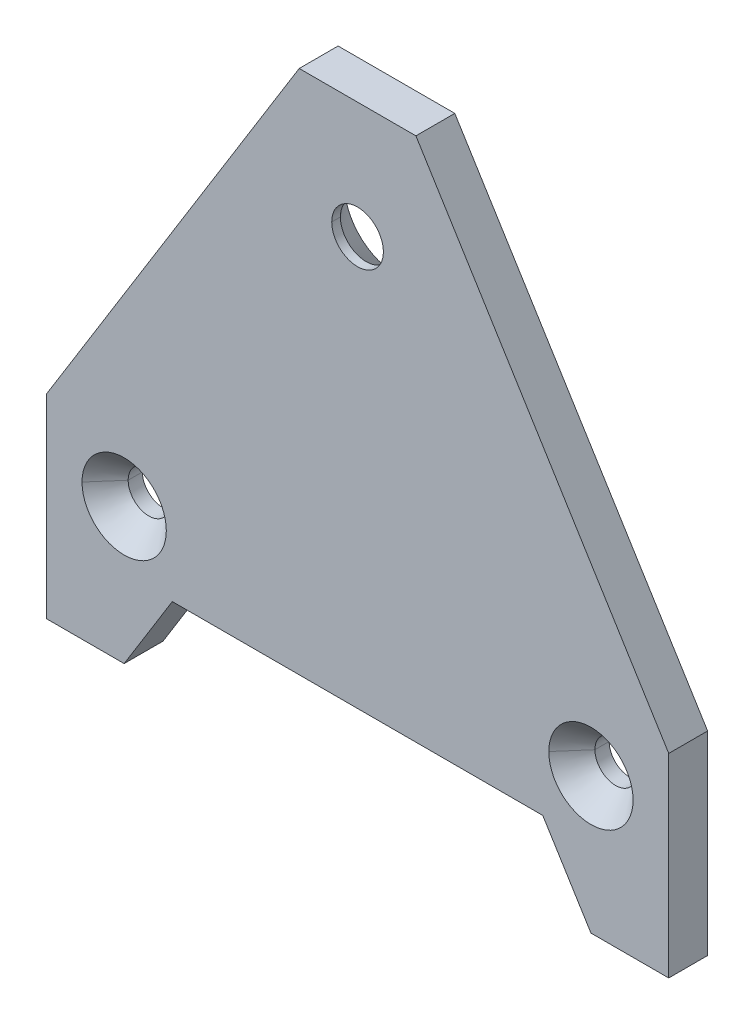
ISO-10303-21;
HEADER;
FILE_DESCRIPTION(('STEP AP214'),'2;1');
FILE_NAME('part.step','',(''),(''),'','','');
FILE_SCHEMA(('AUTOMOTIVE_DESIGN { 1 0 10303 214 1 1 1 1 }'));
ENDSEC;
DATA;
#1=APPLICATION_CONTEXT('core data for automotive mechanical design processes');
#2=APPLICATION_PROTOCOL_DEFINITION('international standard','automotive_design',2000,#1);
#3=PRODUCT_CONTEXT('',#1,'mechanical');
#4=PRODUCT('Part','Part','',(#3));
#5=PRODUCT_RELATED_PRODUCT_CATEGORY('part','',(#4));
#6=PRODUCT_DEFINITION_FORMATION('','',#4);
#7=PRODUCT_DEFINITION_CONTEXT('part definition',#1,'design');
#8=PRODUCT_DEFINITION('design','',#6,#7);
#9=PRODUCT_DEFINITION_SHAPE('','',#8);
#10=(LENGTH_UNIT() NAMED_UNIT(*) SI_UNIT(.MILLI.,.METRE.));
#11=(NAMED_UNIT(*) PLANE_ANGLE_UNIT() SI_UNIT($,.RADIAN.));
#12=(NAMED_UNIT(*) SI_UNIT($,.STERADIAN.) SOLID_ANGLE_UNIT());
#13=UNCERTAINTY_MEASURE_WITH_UNIT(LENGTH_MEASURE(1.E-05),#10,'distance_accuracy_value','');
#14=(GEOMETRIC_REPRESENTATION_CONTEXT(3) GLOBAL_UNCERTAINTY_ASSIGNED_CONTEXT((#13)) GLOBAL_UNIT_ASSIGNED_CONTEXT((#10,
#11,#12)) REPRESENTATION_CONTEXT('',''));
#15=CARTESIAN_POINT('',(0.,0.,0.));
#16=DIRECTION('',(0.,0.,1.));
#17=DIRECTION('',(1.,0.,0.));
#18=AXIS2_PLACEMENT_3D('',#15,#16,#17);
#19=CARTESIAN_POINT('',(0.,30.1625,-3.175));
#20=DIRECTION('',(0.,0.,-1.));
#21=DIRECTION('',(-1.,0.,0.));
#22=AXIS2_PLACEMENT_3D('',#19,#20,#21);
#23=CONICAL_SURFACE('',#22,8.5060917,0.715584993317675);
#24=DIRECTION('',(0.656059028990508,0.,-0.754709580222772));
#25=VECTOR('',#24,1.);
#26=CARTESIAN_POINT('',(8.5060917,30.1625,-3.175));
#27=LINE('',#26,#25);
#28=CARTESIAN_POINT('',(4.2164,30.1625,1.75972580839819));
#29=VERTEX_POINT('',#28);
#30=CARTESIAN_POINT('',(8.5060917,30.1625,-3.175));
#31=VERTEX_POINT('',#30);
#32=EDGE_CURVE('E306',#29,#31,#27,.T.);
#33=ORIENTED_EDGE('',*,*,#32,.F.);
#34=CARTESIAN_POINT('',(0.,30.1625,1.75972580839819));
#35=DIRECTION('',(0.,0.,-1.));
#36=DIRECTION('',(-1.,0.,0.));
#37=AXIS2_PLACEMENT_3D('',#34,#35,#36);
#38=CIRCLE('',#37,4.2164);
#39=CARTESIAN_POINT('',(-4.2164,30.1625,1.75972580839819));
#40=VERTEX_POINT('',#39);
#41=EDGE_CURVE('E11',#40,#29,#38,.T.);
#42=ORIENTED_EDGE('',*,*,#41,.F.);
#43=DIRECTION('',(-0.656059028990508,0.,-0.754709580222772));
#44=VECTOR('',#43,1.);
#45=CARTESIAN_POINT('',(-8.5060917,30.1625,-3.175));
#46=LINE('',#45,#44);
#47=CARTESIAN_POINT('',(-8.5060917,30.1625,-3.175));
#48=VERTEX_POINT('',#47);
#49=EDGE_CURVE('E274',#40,#48,#46,.T.);
#50=ORIENTED_EDGE('',*,*,#49,.T.);
#51=CARTESIAN_POINT('',(0.,30.1625,-3.175));
#52=DIRECTION('',(0.,0.,-1.));
#53=DIRECTION('',(-1.,0.,0.));
#54=AXIS2_PLACEMENT_3D('',#51,#52,#53);
#55=CIRCLE('',#54,8.5060917);
#56=EDGE_CURVE('E283',#48,#31,#55,.T.);
#57=ORIENTED_EDGE('',*,*,#56,.T.);
#58=EDGE_LOOP('',(#33,#42,#50,#57));
#59=FACE_BOUND('',#58,.T.);
#60=ADVANCED_FACE('F16',(#59),#23,.F.);
#61=CARTESIAN_POINT('',(0.,30.1625,-3.175));
#62=DIRECTION('',(0.,0.,-1.));
#63=DIRECTION('',(-1.,0.,0.));
#64=AXIS2_PLACEMENT_3D('',#61,#62,#63);
#65=CYLINDRICAL_SURFACE('',#64,4.2164);
#66=DIRECTION('',(0.,0.,-1.));
#67=VECTOR('',#66,1.);
#68=CARTESIAN_POINT('',(4.2164,30.1625,-3.175));
#69=LINE('',#68,#67);
#70=CARTESIAN_POINT('',(4.2164,30.1625,3.175));
#71=VERTEX_POINT('',#70);
#72=EDGE_CURVE('E325',#71,#29,#69,.T.);
#73=ORIENTED_EDGE('',*,*,#72,.F.);
#74=CARTESIAN_POINT('',(0.,30.1625,3.175));
#75=DIRECTION('',(0.,0.,-1.));
#76=DIRECTION('',(-1.,0.,0.));
#77=AXIS2_PLACEMENT_3D('',#74,#75,#76);
#78=CIRCLE('',#77,4.2164);
#79=CARTESIAN_POINT('',(-4.2164,30.1625,3.175));
#80=VERTEX_POINT('',#79);
#81=EDGE_CURVE('E333',#80,#71,#78,.T.);
#82=ORIENTED_EDGE('',*,*,#81,.F.);
#83=DIRECTION('',(0.,0.,-1.));
#84=VECTOR('',#83,1.);
#85=CARTESIAN_POINT('',(-4.2164,30.1625,-3.175));
#86=LINE('',#85,#84);
#87=EDGE_CURVE('E273',#80,#40,#86,.T.);
#88=ORIENTED_EDGE('',*,*,#87,.T.);
#89=ORIENTED_EDGE('',*,*,#41,.T.);
#90=EDGE_LOOP('',(#73,#82,#88,#89));
#91=FACE_BOUND('',#90,.T.);
#92=ADVANCED_FACE('F586',(#91),#65,.F.);
#93=CARTESIAN_POINT('',(-38.1,-26.9875,3.175));
#94=DIRECTION('',(0.,0.,1.));
#95=DIRECTION('',(1.,0.,0.));
#96=AXIS2_PLACEMENT_3D('',#93,#94,#95);
#97=CONICAL_SURFACE('',#96,6.8804917,0.715584993317675);
#98=DIRECTION('',(-0.656059028990507,0.,0.754709580222772));
#99=VECTOR('',#98,1.);
#100=CARTESIAN_POINT('',(-44.9804917,-26.9875,3.175));
#101=LINE('',#100,#99);
#102=CARTESIAN_POINT('',(-41.4782,-26.9875,-0.853925724552362));
#103=VERTEX_POINT('',#102);
#104=CARTESIAN_POINT('',(-44.9804917,-26.9875,3.175));
#105=VERTEX_POINT('',#104);
#106=EDGE_CURVE('E272',#103,#105,#101,.T.);
#107=ORIENTED_EDGE('',*,*,#106,.F.);
#108=CARTESIAN_POINT('',(-38.1,-26.9875,-0.853925724552362));
#109=DIRECTION('',(0.,0.,1.));
#110=DIRECTION('',(1.,0.,0.));
#111=AXIS2_PLACEMENT_3D('',#108,#109,#110);
#112=CIRCLE('',#111,3.3782);
#113=CARTESIAN_POINT('',(-34.7218,-26.9875,-0.853925724552362));
#114=VERTEX_POINT('',#113);
#115=EDGE_CURVE('E27',#114,#103,#112,.T.);
#116=ORIENTED_EDGE('',*,*,#115,.F.);
#117=DIRECTION('',(0.656059028990507,0.,0.754709580222772));
#118=VECTOR('',#117,1.);
#119=CARTESIAN_POINT('',(-31.2195083,-26.9875,3.175));
#120=LINE('',#119,#118);
#121=CARTESIAN_POINT('',(-31.2195083,-26.9875,3.175));
#122=VERTEX_POINT('',#121);
#123=EDGE_CURVE('E288',#114,#122,#120,.T.);
#124=ORIENTED_EDGE('',*,*,#123,.T.);
#125=CARTESIAN_POINT('',(-38.1,-26.9875,3.175));
#126=DIRECTION('',(0.,0.,1.));
#127=DIRECTION('',(1.,0.,0.));
#128=AXIS2_PLACEMENT_3D('',#125,#126,#127);
#129=CIRCLE('',#128,6.8804917);
#130=EDGE_CURVE('E316',#122,#105,#129,.T.);
#131=ORIENTED_EDGE('',*,*,#130,.T.);
#132=EDGE_LOOP('',(#107,#116,#124,#131));
#133=FACE_BOUND('',#132,.T.);
#134=ADVANCED_FACE('F582',(#133),#97,.F.);
#135=CARTESIAN_POINT('',(-38.1,-26.9875,3.175));
#136=DIRECTION('',(0.,0.,1.));
#137=DIRECTION('',(1.,0.,0.));
#138=AXIS2_PLACEMENT_3D('',#135,#136,#137);
#139=CYLINDRICAL_SURFACE('',#138,3.3782);
#140=DIRECTION('',(0.,0.,1.));
#141=VECTOR('',#140,1.);
#142=CARTESIAN_POINT('',(-41.4782,-26.9875,3.175));
#143=LINE('',#142,#141);
#144=CARTESIAN_POINT('',(-41.4782,-26.9875,-3.175));
#145=VERTEX_POINT('',#144);
#146=EDGE_CURVE('E298',#145,#103,#143,.T.);
#147=ORIENTED_EDGE('',*,*,#146,.F.);
#148=CARTESIAN_POINT('',(-38.1,-26.9875,-3.175));
#149=DIRECTION('',(0.,0.,1.));
#150=DIRECTION('',(1.,0.,0.));
#151=AXIS2_PLACEMENT_3D('',#148,#149,#150);
#152=CIRCLE('',#151,3.3782);
#153=CARTESIAN_POINT('',(-34.7218,-26.9875,-3.175));
#154=VERTEX_POINT('',#153);
#155=EDGE_CURVE('E279',#154,#145,#152,.T.);
#156=ORIENTED_EDGE('',*,*,#155,.F.);
#157=DIRECTION('',(0.,0.,1.));
#158=VECTOR('',#157,1.);
#159=CARTESIAN_POINT('',(-34.7218,-26.9875,3.175));
#160=LINE('',#159,#158);
#161=EDGE_CURVE('E362',#154,#114,#160,.T.);
#162=ORIENTED_EDGE('',*,*,#161,.T.);
#163=ORIENTED_EDGE('',*,*,#115,.T.);
#164=EDGE_LOOP('',(#147,#156,#162,#163));
#165=FACE_BOUND('',#164,.T.);
#166=ADVANCED_FACE('F18',(#165),#139,.F.);
#167=CARTESIAN_POINT('',(38.1,-26.9875,3.175));
#168=DIRECTION('',(0.,0.,1.));
#169=DIRECTION('',(1.,0.,0.));
#170=AXIS2_PLACEMENT_3D('',#167,#168,#169);
#171=CONICAL_SURFACE('',#170,6.8804917,0.715584993317675);
#172=DIRECTION('',(-0.656059028990507,0.,0.754709580222772));
#173=VECTOR('',#172,1.);
#174=CARTESIAN_POINT('',(31.2195083,-26.9875,3.175));
#175=LINE('',#174,#173);
#176=CARTESIAN_POINT('',(34.7218,-26.9875,-0.853925724552362));
#177=VERTEX_POINT('',#176);
#178=CARTESIAN_POINT('',(31.2195083,-26.9875,3.175));
#179=VERTEX_POINT('',#178);
#180=EDGE_CURVE('E307',#177,#179,#175,.T.);
#181=ORIENTED_EDGE('',*,*,#180,.F.);
#182=CARTESIAN_POINT('',(38.1,-26.9875,-0.853925724552362));
#183=DIRECTION('',(0.,0.,1.));
#184=DIRECTION('',(1.,0.,0.));
#185=AXIS2_PLACEMENT_3D('',#182,#183,#184);
#186=CIRCLE('',#185,3.3782);
#187=CARTESIAN_POINT('',(41.4782,-26.9875,-0.853925724552362));
#188=VERTEX_POINT('',#187);
#189=EDGE_CURVE('E261',#188,#177,#186,.T.);
#190=ORIENTED_EDGE('',*,*,#189,.F.);
#191=DIRECTION('',(0.656059028990507,0.,0.754709580222772));
#192=VECTOR('',#191,1.);
#193=CARTESIAN_POINT('',(44.9804917,-26.9875,3.175));
#194=LINE('',#193,#192);
#195=CARTESIAN_POINT('',(44.9804917,-26.9875,3.175));
#196=VERTEX_POINT('',#195);
#197=EDGE_CURVE('E356',#188,#196,#194,.T.);
#198=ORIENTED_EDGE('',*,*,#197,.T.);
#199=CARTESIAN_POINT('',(38.1,-26.9875,3.175));
#200=DIRECTION('',(0.,0.,1.));
#201=DIRECTION('',(1.,0.,0.));
#202=AXIS2_PLACEMENT_3D('',#199,#200,#201);
#203=CIRCLE('',#202,6.8804917);
#204=EDGE_CURVE('E312',#196,#179,#203,.T.);
#205=ORIENTED_EDGE('',*,*,#204,.T.);
#206=EDGE_LOOP('',(#181,#190,#198,#205));
#207=FACE_BOUND('',#206,.T.);
#208=ADVANCED_FACE('F581',(#207),#171,.F.);
#209=CARTESIAN_POINT('',(38.1,-26.9875,3.175));
#210=DIRECTION('',(0.,0.,1.));
#211=DIRECTION('',(1.,0.,0.));
#212=AXIS2_PLACEMENT_3D('',#209,#210,#211);
#213=CYLINDRICAL_SURFACE('',#212,3.3782);
#214=DIRECTION('',(0.,0.,1.));
#215=VECTOR('',#214,1.);
#216=CARTESIAN_POINT('',(34.7218,-26.9875,3.175));
#217=LINE('',#216,#215);
#218=CARTESIAN_POINT('',(34.7218,-26.9875,-3.175));
#219=VERTEX_POINT('',#218);
#220=EDGE_CURVE('E252',#219,#177,#217,.T.);
#221=ORIENTED_EDGE('',*,*,#220,.F.);
#222=CARTESIAN_POINT('',(38.1,-26.9875,-3.175));
#223=DIRECTION('',(0.,0.,1.));
#224=DIRECTION('',(1.,0.,0.));
#225=AXIS2_PLACEMENT_3D('',#222,#223,#224);
#226=CIRCLE('',#225,3.3782);
#227=CARTESIAN_POINT('',(41.4782,-26.9875,-3.175));
#228=VERTEX_POINT('',#227);
#229=EDGE_CURVE('E282',#228,#219,#226,.T.);
#230=ORIENTED_EDGE('',*,*,#229,.F.);
#231=DIRECTION('',(0.,0.,1.));
#232=VECTOR('',#231,1.);
#233=CARTESIAN_POINT('',(41.4782,-26.9875,3.175));
#234=LINE('',#233,#232);
#235=EDGE_CURVE('E245',#228,#188,#234,.T.);
#236=ORIENTED_EDGE('',*,*,#235,.T.);
#237=ORIENTED_EDGE('',*,*,#189,.T.);
#238=EDGE_LOOP('',(#221,#230,#236,#237));
#239=FACE_BOUND('',#238,.T.);
#240=ADVANCED_FACE('F609',(#239),#213,.F.);
#241=CARTESIAN_POINT('',(30.2380952380952,-36.5125,-3.175));
#242=DIRECTION('',(0.850265146687861,0.526354614616297,0.));
#243=DIRECTION('',(0.,0.,-1.));
#244=AXIS2_PLACEMENT_3D('',#241,#242,#243);
#245=PLANE('',#244);
#246=DIRECTION('',(-0.526354614616297,0.850265146687861,0.));
#247=VECTOR('',#246,1.);
#248=CARTESIAN_POINT('',(30.2380952380952,-36.5125,3.175));
#249=LINE('',#248,#247);
#250=CARTESIAN_POINT('',(38.1,-49.2125,3.175));
#251=VERTEX_POINT('',#250);
#252=CARTESIAN_POINT('',(30.2380952380952,-36.5125,3.175));
#253=VERTEX_POINT('',#252);
#254=EDGE_CURVE('E366',#251,#253,#249,.T.);
#255=ORIENTED_EDGE('',*,*,#254,.T.);
#256=DIRECTION('',(0.,0.,1.));
#257=VECTOR('',#256,1.);
#258=CARTESIAN_POINT('',(30.2380952380952,-36.5125,-3.175));
#259=LINE('',#258,#257);
#260=CARTESIAN_POINT('',(30.2380952380952,-36.5125,-3.175));
#261=VERTEX_POINT('',#260);
#262=EDGE_CURVE('E264',#261,#253,#259,.T.);
#263=ORIENTED_EDGE('',*,*,#262,.F.);
#264=DIRECTION('',(-0.526354614616297,0.850265146687861,0.));
#265=VECTOR('',#264,1.);
#266=CARTESIAN_POINT('',(30.2380952380952,-36.5125,-3.175));
#267=LINE('',#266,#265);
#268=CARTESIAN_POINT('',(38.1,-49.2125,-3.175));
#269=VERTEX_POINT('',#268);
#270=EDGE_CURVE('E301',#269,#261,#267,.T.);
#271=ORIENTED_EDGE('',*,*,#270,.F.);
#272=DIRECTION('',(0.,0.,1.));
#273=VECTOR('',#272,1.);
#274=CARTESIAN_POINT('',(38.1,-49.2125,-3.175));
#275=LINE('',#274,#273);
#276=EDGE_CURVE('E319',#269,#251,#275,.T.);
#277=ORIENTED_EDGE('',*,*,#276,.T.);
#278=EDGE_LOOP('',(#255,#263,#271,#277));
#279=FACE_BOUND('',#278,.T.);
#280=ADVANCED_FACE('F613',(#279),#245,.F.);
#281=CARTESIAN_POINT('',(-30.2380952380952,-36.5125,-3.175));
#282=DIRECTION('',(0.,1.,0.));
#283=DIRECTION('',(1.,0.,0.));
#284=AXIS2_PLACEMENT_3D('',#281,#282,#283);
#285=PLANE('',#284);
#286=DIRECTION('',(-1.,0.,0.));
#287=VECTOR('',#286,1.);
#288=CARTESIAN_POINT('',(-30.2380952380952,-36.5125,3.175));
#289=LINE('',#288,#287);
#290=CARTESIAN_POINT('',(-30.2380952380952,-36.5125,3.175));
#291=VERTEX_POINT('',#290);
#292=EDGE_CURVE('E774',#253,#291,#289,.T.);
#293=ORIENTED_EDGE('',*,*,#292,.T.);
#294=DIRECTION('',(0.,0.,1.));
#295=VECTOR('',#294,1.);
#296=CARTESIAN_POINT('',(-30.2380952380952,-36.5125,-3.175));
#297=LINE('',#296,#295);
#298=CARTESIAN_POINT('',(-30.2380952380952,-36.5125,-3.175));
#299=VERTEX_POINT('',#298);
#300=EDGE_CURVE('E42',#299,#291,#297,.T.);
#301=ORIENTED_EDGE('',*,*,#300,.F.);
#302=DIRECTION('',(-1.,0.,0.));
#303=VECTOR('',#302,1.);
#304=CARTESIAN_POINT('',(-30.2380952380952,-36.5125,-3.175));
#305=LINE('',#304,#303);
#306=EDGE_CURVE('E226',#261,#299,#305,.T.);
#307=ORIENTED_EDGE('',*,*,#306,.F.);
#308=ORIENTED_EDGE('',*,*,#262,.T.);
#309=EDGE_LOOP('',(#293,#301,#307,#308));
#310=FACE_BOUND('',#309,.T.);
#311=ADVANCED_FACE('F631',(#310),#285,.F.);
#312=CARTESIAN_POINT('',(-38.1,-49.2125,-3.175));
#313=DIRECTION('',(-0.850265146687861,0.526354614616297,0.));
#314=DIRECTION('',(0.,0.,1.));
#315=AXIS2_PLACEMENT_3D('',#312,#313,#314);
#316=PLANE('',#315);
#317=DIRECTION('',(-0.526354614616297,-0.850265146687861,0.));
#318=VECTOR('',#317,1.);
#319=CARTESIAN_POINT('',(-38.1,-49.2125,3.175));
#320=LINE('',#319,#318);
#321=CARTESIAN_POINT('',(-38.1,-49.2125,3.175));
#322=VERTEX_POINT('',#321);
#323=EDGE_CURVE('E20',#291,#322,#320,.T.);
#324=ORIENTED_EDGE('',*,*,#323,.T.);
#325=DIRECTION('',(0.,0.,1.));
#326=VECTOR('',#325,1.);
#327=CARTESIAN_POINT('',(-38.1,-49.2125,-3.175));
#328=LINE('',#327,#326);
#329=CARTESIAN_POINT('',(-38.1,-49.2125,-3.175));
#330=VERTEX_POINT('',#329);
#331=EDGE_CURVE('E231',#330,#322,#328,.T.);
#332=ORIENTED_EDGE('',*,*,#331,.F.);
#333=DIRECTION('',(-0.526354614616297,-0.850265146687861,0.));
#334=VECTOR('',#333,1.);
#335=CARTESIAN_POINT('',(-38.1,-49.2125,-3.175));
#336=LINE('',#335,#334);
#337=EDGE_CURVE('E220',#299,#330,#336,.T.);
#338=ORIENTED_EDGE('',*,*,#337,.F.);
#339=ORIENTED_EDGE('',*,*,#300,.T.);
#340=EDGE_LOOP('',(#324,#332,#338,#339));
#341=FACE_BOUND('',#340,.T.);
#342=ADVANCED_FACE('F232',(#341),#316,.F.);
#343=CARTESIAN_POINT('',(9.525,49.2125,-3.175));
#344=DIRECTION('',(-0.850265146687862,-0.526354614616296,0.));
#345=DIRECTION('',(-0.526354614616296,0.850265146687862,0.));
#346=AXIS2_PLACEMENT_3D('',#343,#344,#345);
#347=PLANE('',#346);
#348=DIRECTION('',(0.526354614616295,-0.850265146687862,0.));
#349=VECTOR('',#348,1.);
#350=CARTESIAN_POINT('',(9.525,49.2125,3.175));
#351=LINE('',#350,#349);
#352=CARTESIAN_POINT('',(9.525,49.2125,3.175));
#353=VERTEX_POINT('',#352);
#354=CARTESIAN_POINT('',(50.8,-17.4625,3.175));
#355=VERTEX_POINT('',#354);
#356=EDGE_CURVE('E363',#353,#355,#351,.T.);
#357=ORIENTED_EDGE('',*,*,#356,.T.);
#358=DIRECTION('',(0.,0.,1.));
#359=VECTOR('',#358,1.);
#360=CARTESIAN_POINT('',(50.8,-17.4625,-3.175));
#361=LINE('',#360,#359);
#362=CARTESIAN_POINT('',(50.8,-17.4625,-3.175));
#363=VERTEX_POINT('',#362);
#364=EDGE_CURVE('E338',#363,#355,#361,.T.);
#365=ORIENTED_EDGE('',*,*,#364,.F.);
#366=DIRECTION('',(0.526354614616295,-0.850265146687862,0.));
#367=VECTOR('',#366,1.);
#368=CARTESIAN_POINT('',(9.525,49.2125,-3.175));
#369=LINE('',#368,#367);
#370=CARTESIAN_POINT('',(9.525,49.2125,-3.175));
#371=VERTEX_POINT('',#370);
#372=EDGE_CURVE('E260',#371,#363,#369,.T.);
#373=ORIENTED_EDGE('',*,*,#372,.F.);
#374=DIRECTION('',(0.,0.,1.));
#375=VECTOR('',#374,1.);
#376=CARTESIAN_POINT('',(9.525,49.2125,-3.175));
#377=LINE('',#376,#375);
#378=EDGE_CURVE('E350',#371,#353,#377,.T.);
#379=ORIENTED_EDGE('',*,*,#378,.T.);
#380=EDGE_LOOP('',(#357,#365,#373,#379));
#381=FACE_BOUND('',#380,.T.);
#382=ADVANCED_FACE('F408',(#381),#347,.F.);
#383=CARTESIAN_POINT('',(-50.8,-17.4625,-3.175));
#384=DIRECTION('',(0.850265146687862,-0.526354614616295,0.));
#385=DIRECTION('',(0.,0.,-1.));
#386=AXIS2_PLACEMENT_3D('',#383,#384,#385);
#387=PLANE('',#386);
#388=DIRECTION('',(0.526354614616295,0.850265146687862,0.));
#389=VECTOR('',#388,1.);
#390=CARTESIAN_POINT('',(-50.8,-17.4625,3.175));
#391=LINE('',#390,#389);
#392=CARTESIAN_POINT('',(-50.8,-17.4625,3.175));
#393=VERTEX_POINT('',#392);
#394=CARTESIAN_POINT('',(-9.525,49.2125,3.175));
#395=VERTEX_POINT('',#394);
#396=EDGE_CURVE('E193',#393,#395,#391,.T.);
#397=ORIENTED_EDGE('',*,*,#396,.T.);
#398=DIRECTION('',(0.,0.,1.));
#399=VECTOR('',#398,1.);
#400=CARTESIAN_POINT('',(-9.525,49.2125,-3.175));
#401=LINE('',#400,#399);
#402=CARTESIAN_POINT('',(-9.525,49.2125,-3.175));
#403=VERTEX_POINT('',#402);
#404=EDGE_CURVE('E293',#403,#395,#401,.T.);
#405=ORIENTED_EDGE('',*,*,#404,.F.);
#406=DIRECTION('',(0.526354614616295,0.850265146687862,0.));
#407=VECTOR('',#406,1.);
#408=CARTESIAN_POINT('',(-50.8,-17.4625,-3.175));
#409=LINE('',#408,#407);
#410=CARTESIAN_POINT('',(-50.8,-17.4625,-3.175));
#411=VERTEX_POINT('',#410);
#412=EDGE_CURVE('E201',#411,#403,#409,.T.);
#413=ORIENTED_EDGE('',*,*,#412,.F.);
#414=DIRECTION('',(0.,0.,1.));
#415=VECTOR('',#414,1.);
#416=CARTESIAN_POINT('',(-50.8,-17.4625,-3.175));
#417=LINE('',#416,#415);
#418=EDGE_CURVE('E292',#411,#393,#417,.T.);
#419=ORIENTED_EDGE('',*,*,#418,.T.);
#420=EDGE_LOOP('',(#397,#405,#413,#419));
#421=FACE_BOUND('',#420,.T.);
#422=ADVANCED_FACE('F394',(#421),#387,.F.);
#423=CARTESIAN_POINT('',(0.,0.,-3.175));
#424=DIRECTION('',(0.,0.,1.));
#425=DIRECTION('',(1.,0.,0.));
#426=AXIS2_PLACEMENT_3D('',#423,#424,#425);
#427=PLANE('',#426);
#428=ORIENTED_EDGE('',*,*,#229,.T.);
#429=CARTESIAN_POINT('',(38.1,-26.9875,-3.175));
#430=DIRECTION('',(0.,0.,1.));
#431=DIRECTION('',(1.,0.,0.));
#432=AXIS2_PLACEMENT_3D('',#429,#430,#431);
#433=CIRCLE('',#432,3.3782);
#434=EDGE_CURVE('E337',#219,#228,#433,.T.);
#435=ORIENTED_EDGE('',*,*,#434,.T.);
#436=EDGE_LOOP('',(#428,#435));
#437=FACE_BOUND('',#436,.T.);
#438=ORIENTED_EDGE('',*,*,#155,.T.);
#439=CARTESIAN_POINT('',(-38.1,-26.9875,-3.175));
#440=DIRECTION('',(0.,0.,1.));
#441=DIRECTION('',(1.,0.,0.));
#442=AXIS2_PLACEMENT_3D('',#439,#440,#441);
#443=CIRCLE('',#442,3.3782);
#444=EDGE_CURVE('E294',#145,#154,#443,.T.);
#445=ORIENTED_EDGE('',*,*,#444,.T.);
#446=EDGE_LOOP('',(#438,#445));
#447=FACE_BOUND('',#446,.T.);
#448=ORIENTED_EDGE('',*,*,#56,.F.);
#449=CARTESIAN_POINT('',(0.,30.1625,-3.175));
#450=DIRECTION('',(0.,0.,-1.));
#451=DIRECTION('',(-1.,0.,0.));
#452=AXIS2_PLACEMENT_3D('',#449,#450,#451);
#453=CIRCLE('',#452,8.5060917);
#454=EDGE_CURVE('E278',#31,#48,#453,.T.);
#455=ORIENTED_EDGE('',*,*,#454,.F.);
#456=EDGE_LOOP('',(#448,#455));
#457=FACE_BOUND('',#456,.T.);
#458=ORIENTED_EDGE('',*,*,#306,.T.);
#459=ORIENTED_EDGE('',*,*,#337,.T.);
#460=DIRECTION('',(1.,0.,0.));
#461=VECTOR('',#460,1.);
#462=CARTESIAN_POINT('',(-50.8,-49.2125,-3.175));
#463=LINE('',#462,#461);
#464=CARTESIAN_POINT('',(-50.8,-49.2125,-3.175));
#465=VERTEX_POINT('',#464);
#466=EDGE_CURVE('E224',#465,#330,#463,.T.);
#467=ORIENTED_EDGE('',*,*,#466,.F.);
#468=DIRECTION('',(0.,-1.,0.));
#469=VECTOR('',#468,1.);
#470=CARTESIAN_POINT('',(-50.8,49.2125,-3.175));
#471=LINE('',#470,#469);
#472=EDGE_CURVE('E330',#411,#465,#471,.T.);
#473=ORIENTED_EDGE('',*,*,#472,.F.);
#474=ORIENTED_EDGE('',*,*,#412,.T.);
#475=DIRECTION('',(-1.,0.,0.));
#476=VECTOR('',#475,1.);
#477=CARTESIAN_POINT('',(-50.8,49.2125,-3.175));
#478=LINE('',#477,#476);
#479=EDGE_CURVE('E379',#371,#403,#478,.T.);
#480=ORIENTED_EDGE('',*,*,#479,.F.);
#481=ORIENTED_EDGE('',*,*,#372,.T.);
#482=DIRECTION('',(0.,1.,0.));
#483=VECTOR('',#482,1.);
#484=CARTESIAN_POINT('',(50.8,49.2125,-3.175));
#485=LINE('',#484,#483);
#486=CARTESIAN_POINT('',(50.8,-49.2125,-3.175));
#487=VERTEX_POINT('',#486);
#488=EDGE_CURVE('E267',#487,#363,#485,.T.);
#489=ORIENTED_EDGE('',*,*,#488,.F.);
#490=DIRECTION('',(1.,0.,0.));
#491=VECTOR('',#490,1.);
#492=CARTESIAN_POINT('',(-50.8,-49.2125,-3.175));
#493=LINE('',#492,#491);
#494=EDGE_CURVE('E322',#269,#487,#493,.T.);
#495=ORIENTED_EDGE('',*,*,#494,.F.);
#496=ORIENTED_EDGE('',*,*,#270,.T.);
#497=EDGE_LOOP('',(#458,#459,#467,#473,#474,#480,#481,#489,#495,#496));
#498=FACE_BOUND('',#497,.T.);
#499=ADVANCED_FACE('F222',(#437,#447,#457,#498),#427,.F.);
#500=CARTESIAN_POINT('',(0.,0.,3.175));
#501=DIRECTION('',(0.,0.,1.));
#502=DIRECTION('',(1.,0.,0.));
#503=AXIS2_PLACEMENT_3D('',#500,#501,#502);
#504=PLANE('',#503);
#505=ORIENTED_EDGE('',*,*,#204,.F.);
#506=CARTESIAN_POINT('',(38.1,-26.9875,3.175));
#507=DIRECTION('',(0.,0.,1.));
#508=DIRECTION('',(1.,0.,0.));
#509=AXIS2_PLACEMENT_3D('',#506,#507,#508);
#510=CIRCLE('',#509,6.8804917);
#511=EDGE_CURVE('E256',#179,#196,#510,.T.);
#512=ORIENTED_EDGE('',*,*,#511,.F.);
#513=EDGE_LOOP('',(#505,#512));
#514=FACE_BOUND('',#513,.T.);
#515=ORIENTED_EDGE('',*,*,#130,.F.);
#516=CARTESIAN_POINT('',(-38.1,-26.9875,3.175));
#517=DIRECTION('',(0.,0.,1.));
#518=DIRECTION('',(1.,0.,0.));
#519=AXIS2_PLACEMENT_3D('',#516,#517,#518);
#520=CIRCLE('',#519,6.8804917);
#521=EDGE_CURVE('E284',#105,#122,#520,.T.);
#522=ORIENTED_EDGE('',*,*,#521,.F.);
#523=EDGE_LOOP('',(#515,#522));
#524=FACE_BOUND('',#523,.T.);
#525=ORIENTED_EDGE('',*,*,#81,.T.);
#526=CARTESIAN_POINT('',(0.,30.1625,3.175));
#527=DIRECTION('',(0.,0.,-1.));
#528=DIRECTION('',(-1.,0.,0.));
#529=AXIS2_PLACEMENT_3D('',#526,#527,#528);
#530=CIRCLE('',#529,4.2164);
#531=EDGE_CURVE('E277',#71,#80,#530,.T.);
#532=ORIENTED_EDGE('',*,*,#531,.T.);
#533=EDGE_LOOP('',(#525,#532));
#534=FACE_BOUND('',#533,.T.);
#535=ORIENTED_EDGE('',*,*,#323,.F.);
#536=ORIENTED_EDGE('',*,*,#292,.F.);
#537=ORIENTED_EDGE('',*,*,#254,.F.);
#538=DIRECTION('',(1.,0.,0.));
#539=VECTOR('',#538,1.);
#540=CARTESIAN_POINT('',(-50.8,-49.2125,3.175));
#541=LINE('',#540,#539);
#542=CARTESIAN_POINT('',(50.8,-49.2125,3.175));
#543=VERTEX_POINT('',#542);
#544=EDGE_CURVE('E323',#251,#543,#541,.T.);
#545=ORIENTED_EDGE('',*,*,#544,.T.);
#546=DIRECTION('',(0.,1.,0.));
#547=VECTOR('',#546,1.);
#548=CARTESIAN_POINT('',(50.8,49.2125,3.175));
#549=LINE('',#548,#547);
#550=EDGE_CURVE('E342',#543,#355,#549,.T.);
#551=ORIENTED_EDGE('',*,*,#550,.T.);
#552=ORIENTED_EDGE('',*,*,#356,.F.);
#553=DIRECTION('',(-1.,0.,0.));
#554=VECTOR('',#553,1.);
#555=CARTESIAN_POINT('',(-50.8,49.2125,3.175));
#556=LINE('',#555,#554);
#557=EDGE_CURVE('E347',#353,#395,#556,.T.);
#558=ORIENTED_EDGE('',*,*,#557,.T.);
#559=ORIENTED_EDGE('',*,*,#396,.F.);
#560=DIRECTION('',(0.,-1.,0.));
#561=VECTOR('',#560,1.);
#562=CARTESIAN_POINT('',(-50.8,49.2125,3.175));
#563=LINE('',#562,#561);
#564=CARTESIAN_POINT('',(-50.8,-49.2125,3.175));
#565=VERTEX_POINT('',#564);
#566=EDGE_CURVE('E289',#393,#565,#563,.T.);
#567=ORIENTED_EDGE('',*,*,#566,.T.);
#568=DIRECTION('',(1.,0.,0.));
#569=VECTOR('',#568,1.);
#570=CARTESIAN_POINT('',(-50.8,-49.2125,3.175));
#571=LINE('',#570,#569);
#572=EDGE_CURVE('E238',#565,#322,#571,.T.);
#573=ORIENTED_EDGE('',*,*,#572,.T.);
#574=EDGE_LOOP('',(#535,#536,#537,#545,#551,#552,#558,#559,#567,#573));
#575=FACE_BOUND('',#574,.T.);
#576=ADVANCED_FACE('F404',(#514,#524,#534,#575),#504,.T.);
#577=CARTESIAN_POINT('',(-50.8,-49.2125,3.175));
#578=DIRECTION('',(0.,1.,0.));
#579=DIRECTION('',(1.,0.,0.));
#580=AXIS2_PLACEMENT_3D('',#577,#578,#579);
#581=PLANE('',#580);
#582=ORIENTED_EDGE('',*,*,#544,.F.);
#583=ORIENTED_EDGE('',*,*,#276,.F.);
#584=ORIENTED_EDGE('',*,*,#494,.T.);
#585=DIRECTION('',(0.,0.,-1.));
#586=VECTOR('',#585,1.);
#587=CARTESIAN_POINT('',(50.8,-49.2125,3.175));
#588=LINE('',#587,#586);
#589=EDGE_CURVE('E351',#543,#487,#588,.T.);
#590=ORIENTED_EDGE('',*,*,#589,.F.);
#591=EDGE_LOOP('',(#582,#583,#584,#590));
#592=FACE_BOUND('',#591,.T.);
#593=ADVANCED_FACE('F622',(#592),#581,.F.);
#594=CARTESIAN_POINT('',(-50.8,49.2125,3.175));
#595=DIRECTION('',(1.,0.,0.));
#596=DIRECTION('',(0.,1.,0.));
#597=AXIS2_PLACEMENT_3D('',#594,#595,#596);
#598=PLANE('',#597);
#599=ORIENTED_EDGE('',*,*,#566,.F.);
#600=ORIENTED_EDGE('',*,*,#418,.F.);
#601=ORIENTED_EDGE('',*,*,#472,.T.);
#602=DIRECTION('',(0.,0.,-1.));
#603=VECTOR('',#602,1.);
#604=CARTESIAN_POINT('',(-50.8,-49.2125,3.175));
#605=LINE('',#604,#603);
#606=EDGE_CURVE('E243',#565,#465,#605,.T.);
#607=ORIENTED_EDGE('',*,*,#606,.F.);
#608=EDGE_LOOP('',(#599,#600,#601,#607));
#609=FACE_BOUND('',#608,.T.);
#610=ADVANCED_FACE('F414',(#609),#598,.F.);
#611=CARTESIAN_POINT('',(-50.8,49.2125,3.175));
#612=DIRECTION('',(0.,-1.,0.));
#613=DIRECTION('',(0.,0.,-1.));
#614=AXIS2_PLACEMENT_3D('',#611,#612,#613);
#615=PLANE('',#614);
#616=ORIENTED_EDGE('',*,*,#557,.F.);
#617=ORIENTED_EDGE('',*,*,#378,.F.);
#618=ORIENTED_EDGE('',*,*,#479,.T.);
#619=ORIENTED_EDGE('',*,*,#404,.T.);
#620=EDGE_LOOP('',(#616,#617,#618,#619));
#621=FACE_BOUND('',#620,.T.);
#622=ADVANCED_FACE('F399',(#621),#615,.F.);
#623=CARTESIAN_POINT('',(50.8,49.2125,3.175));
#624=DIRECTION('',(-1.,0.,0.));
#625=DIRECTION('',(0.,1.,0.));
#626=AXIS2_PLACEMENT_3D('',#623,#624,#625);
#627=PLANE('',#626);
#628=ORIENTED_EDGE('',*,*,#488,.T.);
#629=ORIENTED_EDGE('',*,*,#364,.T.);
#630=ORIENTED_EDGE('',*,*,#550,.F.);
#631=ORIENTED_EDGE('',*,*,#589,.T.);
#632=EDGE_LOOP('',(#628,#629,#630,#631));
#633=FACE_BOUND('',#632,.T.);
#634=ADVANCED_FACE('F604',(#633),#627,.F.);
#635=CARTESIAN_POINT('',(-50.8,-49.2125,3.175));
#636=DIRECTION('',(0.,1.,0.));
#637=DIRECTION('',(1.,0.,0.));
#638=AXIS2_PLACEMENT_3D('',#635,#636,#637);
#639=PLANE('',#638);
#640=ORIENTED_EDGE('',*,*,#466,.T.);
#641=ORIENTED_EDGE('',*,*,#331,.T.);
#642=ORIENTED_EDGE('',*,*,#572,.F.);
#643=ORIENTED_EDGE('',*,*,#606,.T.);
#644=EDGE_LOOP('',(#640,#641,#642,#643));
#645=FACE_BOUND('',#644,.T.);
#646=ADVANCED_FACE('F241',(#645),#639,.F.);
#647=CARTESIAN_POINT('',(38.1,-26.9875,3.175));
#648=DIRECTION('',(0.,0.,1.));
#649=DIRECTION('',(1.,0.,0.));
#650=AXIS2_PLACEMENT_3D('',#647,#648,#649);
#651=CYLINDRICAL_SURFACE('',#650,3.3782);
#652=ORIENTED_EDGE('',*,*,#434,.F.);
#653=ORIENTED_EDGE('',*,*,#220,.T.);
#654=CARTESIAN_POINT('',(38.1,-26.9875,-0.853925724552362));
#655=DIRECTION('',(0.,0.,1.));
#656=DIRECTION('',(1.,0.,0.));
#657=AXIS2_PLACEMENT_3D('',#654,#655,#656);
#658=CIRCLE('',#657,3.3782);
#659=EDGE_CURVE('E311',#177,#188,#658,.T.);
#660=ORIENTED_EDGE('',*,*,#659,.T.);
#661=ORIENTED_EDGE('',*,*,#235,.F.);
#662=EDGE_LOOP('',(#652,#653,#660,#661));
#663=FACE_BOUND('',#662,.T.);
#664=ADVANCED_FACE('F603',(#663),#651,.F.);
#665=CARTESIAN_POINT('',(38.1,-26.9875,3.175));
#666=DIRECTION('',(0.,0.,1.));
#667=DIRECTION('',(1.,0.,0.));
#668=AXIS2_PLACEMENT_3D('',#665,#666,#667);
#669=CONICAL_SURFACE('',#668,6.8804917,0.715584993317675);
#670=ORIENTED_EDGE('',*,*,#659,.F.);
#671=ORIENTED_EDGE('',*,*,#180,.T.);
#672=ORIENTED_EDGE('',*,*,#511,.T.);
#673=ORIENTED_EDGE('',*,*,#197,.F.);
#674=EDGE_LOOP('',(#670,#671,#672,#673));
#675=FACE_BOUND('',#674,.T.);
#676=ADVANCED_FACE('F637',(#675),#669,.F.);
#677=CARTESIAN_POINT('',(-38.1,-26.9875,3.175));
#678=DIRECTION('',(0.,0.,1.));
#679=DIRECTION('',(1.,0.,0.));
#680=AXIS2_PLACEMENT_3D('',#677,#678,#679);
#681=CYLINDRICAL_SURFACE('',#680,3.3782);
#682=ORIENTED_EDGE('',*,*,#444,.F.);
#683=ORIENTED_EDGE('',*,*,#146,.T.);
#684=CARTESIAN_POINT('',(-38.1,-26.9875,-0.853925724552362));
#685=DIRECTION('',(0.,0.,1.));
#686=DIRECTION('',(1.,0.,0.));
#687=AXIS2_PLACEMENT_3D('',#684,#685,#686);
#688=CIRCLE('',#687,3.3782);
#689=EDGE_CURVE('E268',#103,#114,#688,.T.);
#690=ORIENTED_EDGE('',*,*,#689,.T.);
#691=ORIENTED_EDGE('',*,*,#161,.F.);
#692=EDGE_LOOP('',(#682,#683,#690,#691));
#693=FACE_BOUND('',#692,.T.);
#694=ADVANCED_FACE('F641',(#693),#681,.F.);
#695=CARTESIAN_POINT('',(-38.1,-26.9875,3.175));
#696=DIRECTION('',(0.,0.,1.));
#697=DIRECTION('',(1.,0.,0.));
#698=AXIS2_PLACEMENT_3D('',#695,#696,#697);
#699=CONICAL_SURFACE('',#698,6.8804917,0.715584993317675);
#700=ORIENTED_EDGE('',*,*,#689,.F.);
#701=ORIENTED_EDGE('',*,*,#106,.T.);
#702=ORIENTED_EDGE('',*,*,#521,.T.);
#703=ORIENTED_EDGE('',*,*,#123,.F.);
#704=EDGE_LOOP('',(#700,#701,#702,#703));
#705=FACE_BOUND('',#704,.T.);
#706=ADVANCED_FACE('F670',(#705),#699,.F.);
#707=CARTESIAN_POINT('',(0.,30.1625,-3.175));
#708=DIRECTION('',(0.,0.,-1.));
#709=DIRECTION('',(-1.,0.,0.));
#710=AXIS2_PLACEMENT_3D('',#707,#708,#709);
#711=CYLINDRICAL_SURFACE('',#710,4.2164);
#712=ORIENTED_EDGE('',*,*,#531,.F.);
#713=ORIENTED_EDGE('',*,*,#72,.T.);
#714=CARTESIAN_POINT('',(0.,30.1625,1.75972580839819));
#715=DIRECTION('',(0.,0.,-1.));
#716=DIRECTION('',(-1.,0.,0.));
#717=AXIS2_PLACEMENT_3D('',#714,#715,#716);
#718=CIRCLE('',#717,4.2164);
#719=EDGE_CURVE('E302',#29,#40,#718,.T.);
#720=ORIENTED_EDGE('',*,*,#719,.T.);
#721=ORIENTED_EDGE('',*,*,#87,.F.);
#722=EDGE_LOOP('',(#712,#713,#720,#721));
#723=FACE_BOUND('',#722,.T.);
#724=ADVANCED_FACE('F674',(#723),#711,.F.);
#725=CARTESIAN_POINT('',(0.,30.1625,-3.175));
#726=DIRECTION('',(0.,0.,-1.));
#727=DIRECTION('',(-1.,0.,0.));
#728=AXIS2_PLACEMENT_3D('',#725,#726,#727);
#729=CONICAL_SURFACE('',#728,8.5060917,0.715584993317675);
#730=ORIENTED_EDGE('',*,*,#719,.F.);
#731=ORIENTED_EDGE('',*,*,#32,.T.);
#732=ORIENTED_EDGE('',*,*,#454,.T.);
#733=ORIENTED_EDGE('',*,*,#49,.F.);
#734=EDGE_LOOP('',(#730,#731,#732,#733));
#735=FACE_BOUND('',#734,.T.);
#736=ADVANCED_FACE('F683',(#735),#729,.F.);
#737=CLOSED_SHELL('',(#60,#92,#134,#166,#208,#240,#280,#311,#342,#382,#422,#499,#576,#593,#610,
#622,#634,#646,#664,#676,#694,#706,#724,#736));
#738=MANIFOLD_SOLID_BREP('B1',#737);
#739=ADVANCED_BREP_SHAPE_REPRESENTATION('',(#18,#738),#14);
#740=SHAPE_DEFINITION_REPRESENTATION(#9,#739);
ENDSEC;
END-ISO-10303-21;
